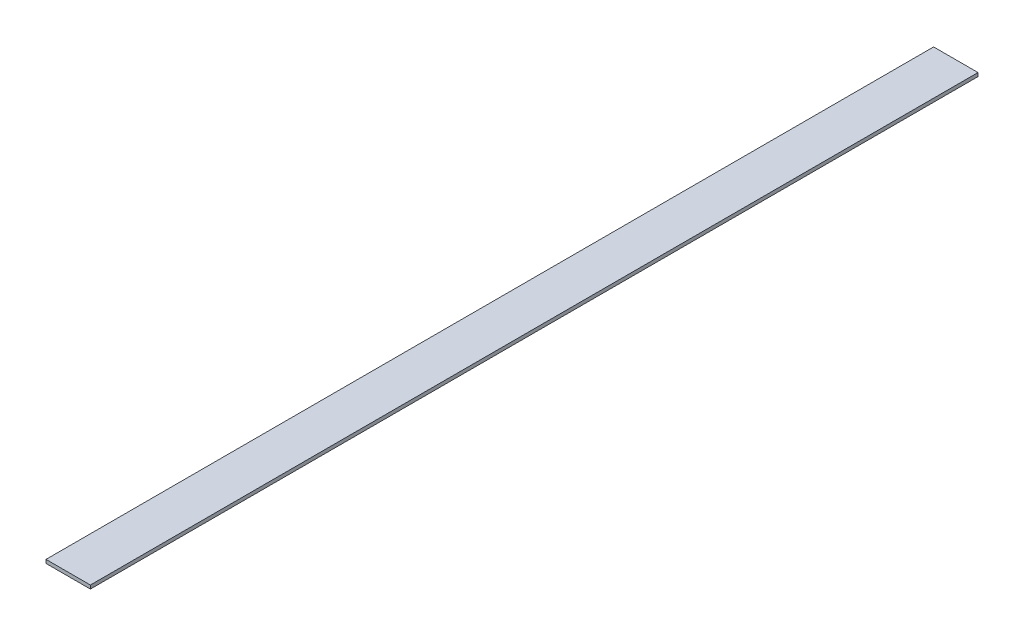
ISO-10303-21;
HEADER;
FILE_DESCRIPTION(('STEP AP214'),'2;1');
FILE_NAME('part.step','',(''),(''),'','','');
FILE_SCHEMA(('AUTOMOTIVE_DESIGN { 1 0 10303 214 1 1 1 1 }'));
ENDSEC;
DATA;
#1=APPLICATION_CONTEXT('core data for automotive mechanical design processes');
#2=APPLICATION_PROTOCOL_DEFINITION('international standard','automotive_design',2000,#1);
#3=PRODUCT_CONTEXT('',#1,'mechanical');
#4=PRODUCT('Part','Part','',(#3));
#5=PRODUCT_RELATED_PRODUCT_CATEGORY('part','',(#4));
#6=PRODUCT_DEFINITION_FORMATION('','',#4);
#7=PRODUCT_DEFINITION_CONTEXT('part definition',#1,'design');
#8=PRODUCT_DEFINITION('design','',#6,#7);
#9=PRODUCT_DEFINITION_SHAPE('','',#8);
#10=(LENGTH_UNIT() NAMED_UNIT(*) SI_UNIT(.MILLI.,.METRE.));
#11=(NAMED_UNIT(*) PLANE_ANGLE_UNIT() SI_UNIT($,.RADIAN.));
#12=(NAMED_UNIT(*) SI_UNIT($,.STERADIAN.) SOLID_ANGLE_UNIT());
#13=UNCERTAINTY_MEASURE_WITH_UNIT(LENGTH_MEASURE(1.E-05),#10,'distance_accuracy_value','');
#14=(GEOMETRIC_REPRESENTATION_CONTEXT(3) GLOBAL_UNCERTAINTY_ASSIGNED_CONTEXT((#13)) GLOBAL_UNIT_ASSIGNED_CONTEXT((#10,
#11,#12)) REPRESENTATION_CONTEXT('',''));
#15=CARTESIAN_POINT('',(0.,0.,0.));
#16=DIRECTION('',(0.,0.,1.));
#17=DIRECTION('',(1.,0.,0.));
#18=AXIS2_PLACEMENT_3D('',#15,#16,#17);
#19=CARTESIAN_POINT('',(25.0000000000005,0.,499.999999999997));
#20=DIRECTION('',(0.999999999999994,0.,0.));
#21=DIRECTION('',(0.,1.,0.));
#22=AXIS2_PLACEMENT_3D('',#19,#20,#21);
#23=PLANE('',#22);
#24=DIRECTION('',(0.,-1.,0.));
#25=VECTOR('',#24,1.);
#26=CARTESIAN_POINT('',(25.0000000000005,0.,0.));
#27=LINE('',#26,#25);
#28=CARTESIAN_POINT('',(25.0000000000006,25.,0.));
#29=VERTEX_POINT('',#28);
#30=CARTESIAN_POINT('',(25.0000000000006,23.,0.));
#31=VERTEX_POINT('',#30);
#32=EDGE_CURVE('E165',#29,#31,#27,.T.);
#33=ORIENTED_EDGE('',*,*,#32,.F.);
#34=DIRECTION('',(0.,0.,-0.999999999999994));
#35=VECTOR('',#34,1.);
#36=CARTESIAN_POINT('',(25.0000000000005,25.,499.999999999997));
#37=LINE('',#36,#35);
#38=CARTESIAN_POINT('',(25.0000000000005,25.,499.999999999997));
#39=VERTEX_POINT('',#38);
#40=EDGE_CURVE('E94',#39,#29,#37,.T.);
#41=ORIENTED_EDGE('',*,*,#40,.F.);
#42=DIRECTION('',(0.,-1.,0.));
#43=VECTOR('',#42,1.);
#44=CARTESIAN_POINT('',(25.0000000000005,0.,499.999999999997));
#45=LINE('',#44,#43);
#46=CARTESIAN_POINT('',(25.0000000000005,23.,499.999999999997));
#47=VERTEX_POINT('',#46);
#48=EDGE_CURVE('E188',#39,#47,#45,.T.);
#49=ORIENTED_EDGE('',*,*,#48,.T.);
#50=DIRECTION('',(0.,0.,-0.999999999999994));
#51=VECTOR('',#50,1.);
#52=CARTESIAN_POINT('',(25.0000000000005,23.,499.999999999997));
#53=LINE('',#52,#51);
#54=EDGE_CURVE('E181',#47,#31,#53,.T.);
#55=ORIENTED_EDGE('',*,*,#54,.T.);
#56=EDGE_LOOP('',(#33,#41,#49,#55));
#57=FACE_BOUND('',#56,.T.);
#58=ADVANCED_FACE('F44',(#57),#23,.T.);
#59=CARTESIAN_POINT('',(1.33226762955018E-12,25.,499.999999999997));
#60=DIRECTION('',(0.,1.,0.));
#61=DIRECTION('',(0.,0.,0.999999999999994));
#62=AXIS2_PLACEMENT_3D('',#59,#60,#61);
#63=PLANE('',#62);
#64=DIRECTION('',(0.999999999999994,0.,0.));
#65=VECTOR('',#64,1.);
#66=CARTESIAN_POINT('',(1.11022302462515E-12,25.,0.));
#67=LINE('',#66,#65);
#68=CARTESIAN_POINT('',(1.11022302462515E-12,25.,0.));
#69=VERTEX_POINT('',#68);
#70=EDGE_CURVE('E191',#69,#29,#67,.T.);
#71=ORIENTED_EDGE('',*,*,#70,.F.);
#72=DIRECTION('',(0.,0.,-0.999999999999994));
#73=VECTOR('',#72,1.);
#74=CARTESIAN_POINT('',(1.33226762955018E-12,25.,499.999999999997));
#75=LINE('',#74,#73);
#76=CARTESIAN_POINT('',(1.33226762955018E-12,25.,499.999999999997));
#77=VERTEX_POINT('',#76);
#78=EDGE_CURVE('E136',#77,#69,#75,.T.);
#79=ORIENTED_EDGE('',*,*,#78,.F.);
#80=DIRECTION('',(0.999999999999994,0.,0.));
#81=VECTOR('',#80,1.);
#82=CARTESIAN_POINT('',(1.33226762955018E-12,25.,499.999999999997));
#83=LINE('',#82,#81);
#84=EDGE_CURVE('E201',#77,#39,#83,.T.);
#85=ORIENTED_EDGE('',*,*,#84,.T.);
#86=ORIENTED_EDGE('',*,*,#40,.T.);
#87=EDGE_LOOP('',(#71,#79,#85,#86));
#88=FACE_BOUND('',#87,.T.);
#89=ADVANCED_FACE('F237',(#88),#63,.T.);
#90=CARTESIAN_POINT('',(2.2204460492503E-13,0.,499.999999999997));
#91=DIRECTION('',(-0.999999999999994,0.,0.));
#92=DIRECTION('',(0.,-1.,0.));
#93=AXIS2_PLACEMENT_3D('',#90,#91,#92);
#94=PLANE('',#93);
#95=DIRECTION('',(0.,0.707106781186548,-0.707106781186542));
#96=VECTOR('',#95,1.);
#97=CARTESIAN_POINT('',(0.,0.,22.9999999999996));
#98=LINE('',#97,#96);
#99=CARTESIAN_POINT('',(0.,0.,22.9999999999996));
#100=VERTEX_POINT('',#99);
#101=CARTESIAN_POINT('',(1.11022302462515E-12,23.,0.));
#102=VERTEX_POINT('',#101);
#103=EDGE_CURVE('E59',#100,#102,#98,.T.);
#104=ORIENTED_EDGE('',*,*,#103,.F.);
#105=DIRECTION('',(0.,0.,-0.999999999999994));
#106=VECTOR('',#105,1.);
#107=CARTESIAN_POINT('',(2.2204460492503E-13,0.,499.999999999997));
#108=LINE('',#107,#106);
#109=CARTESIAN_POINT('',(0.,2.77555756156289E-13,476.999999999997));
#110=VERTEX_POINT('',#109);
#111=EDGE_CURVE('E127',#110,#100,#108,.T.);
#112=ORIENTED_EDGE('',*,*,#111,.F.);
#113=DIRECTION('',(0.,-0.707106781186547,-0.707106781186542));
#114=VECTOR('',#113,1.);
#115=CARTESIAN_POINT('',(1.33226762955018E-12,23.,499.999999999997));
#116=LINE('',#115,#114);
#117=CARTESIAN_POINT('',(1.33226762955018E-12,23.,499.999999999997));
#118=VERTEX_POINT('',#117);
#119=EDGE_CURVE('E226',#118,#110,#116,.T.);
#120=ORIENTED_EDGE('',*,*,#119,.F.);
#121=DIRECTION('',(0.,1.,0.));
#122=VECTOR('',#121,1.);
#123=CARTESIAN_POINT('',(2.2204460492503E-13,0.,499.999999999997));
#124=LINE('',#123,#122);
#125=EDGE_CURVE('E198',#118,#77,#124,.T.);
#126=ORIENTED_EDGE('',*,*,#125,.T.);
#127=ORIENTED_EDGE('',*,*,#78,.T.);
#128=DIRECTION('',(0.,1.,0.));
#129=VECTOR('',#128,1.);
#130=CARTESIAN_POINT('',(0.,0.,0.));
#131=LINE('',#130,#129);
#132=EDGE_CURVE('E129',#102,#69,#131,.T.);
#133=ORIENTED_EDGE('',*,*,#132,.F.);
#134=EDGE_LOOP('',(#104,#112,#120,#126,#127,#133));
#135=FACE_BOUND('',#134,.T.);
#136=CARTESIAN_POINT('',(1.33226762955018E-12,12.5,99.9999999999995));
#137=DIRECTION('',(-0.999999999999994,0.,0.));
#138=DIRECTION('',(0.,-1.,0.));
#139=AXIS2_PLACEMENT_3D('',#136,#137,#138);
#140=CIRCLE('',#139,2.);
#141=CARTESIAN_POINT('',(1.33053290607421E-12,10.5,99.9999999999996));
#142=VERTEX_POINT('',#141);
#143=EDGE_CURVE('E154',#142,#142,#140,.T.);
#144=ORIENTED_EDGE('',*,*,#143,.F.);
#145=EDGE_LOOP('',(#144));
#146=FACE_BOUND('',#145,.T.);
#147=CARTESIAN_POINT('',(1.11022302462515E-12,12.5,199.999999999999));
#148=DIRECTION('',(-0.999999999999994,0.,0.));
#149=DIRECTION('',(0.,-1.,0.));
#150=AXIS2_PLACEMENT_3D('',#147,#148,#149);
#151=CIRCLE('',#150,2.);
#152=CARTESIAN_POINT('',(1.10848830114918E-12,10.5,199.999999999999));
#153=VERTEX_POINT('',#152);
#154=EDGE_CURVE('E215',#153,#153,#151,.T.);
#155=ORIENTED_EDGE('',*,*,#154,.F.);
#156=EDGE_LOOP('',(#155));
#157=FACE_BOUND('',#156,.T.);
#158=CARTESIAN_POINT('',(1.11022302462515E-12,12.5000000000002,299.999999999997));
#159=DIRECTION('',(-0.999999999999994,0.,0.));
#160=DIRECTION('',(0.,-1.,0.));
#161=AXIS2_PLACEMENT_3D('',#158,#159,#160);
#162=CIRCLE('',#161,2.);
#163=CARTESIAN_POINT('',(1.10848830114918E-12,10.5000000000002,299.999999999997));
#164=VERTEX_POINT('',#163);
#165=EDGE_CURVE('E211',#164,#164,#162,.T.);
#166=ORIENTED_EDGE('',*,*,#165,.F.);
#167=EDGE_LOOP('',(#166));
#168=FACE_BOUND('',#167,.T.);
#169=CARTESIAN_POINT('',(1.11022302462515E-12,12.5000000000002,399.999999999997));
#170=DIRECTION('',(-0.999999999999994,0.,0.));
#171=DIRECTION('',(0.,-1.,0.));
#172=AXIS2_PLACEMENT_3D('',#169,#170,#171);
#173=CIRCLE('',#172,2.);
#174=CARTESIAN_POINT('',(1.10848830114918E-12,10.5000000000002,399.999999999997));
#175=VERTEX_POINT('',#174);
#176=EDGE_CURVE('E207',#175,#175,#173,.T.);
#177=ORIENTED_EDGE('',*,*,#176,.F.);
#178=EDGE_LOOP('',(#177));
#179=FACE_BOUND('',#178,.T.);
#180=ADVANCED_FACE('F124',(#135,#146,#157,#168,#179),#94,.T.);
#181=CARTESIAN_POINT('',(2.2204460492503E-13,0.,499.999999999997));
#182=DIRECTION('',(0.,1.,0.));
#183=DIRECTION('',(0.,0.,0.999999999999994));
#184=AXIS2_PLACEMENT_3D('',#181,#182,#183);
#185=PLANE('',#184);
#186=ORIENTED_EDGE('',*,*,#111,.T.);
#187=DIRECTION('',(-0.999999999999994,0.,0.));
#188=VECTOR('',#187,1.);
#189=CARTESIAN_POINT('',(10.0000000000006,0.,22.9999999999996));
#190=LINE('',#189,#188);
#191=CARTESIAN_POINT('',(2.00000000000076,0.,22.9999999999996));
#192=VERTEX_POINT('',#191);
#193=EDGE_CURVE('E111',#192,#100,#190,.T.);
#194=ORIENTED_EDGE('',*,*,#193,.F.);
#195=DIRECTION('',(0.,0.,-0.999999999999994));
#196=VECTOR('',#195,1.);
#197=CARTESIAN_POINT('',(2.00000000000076,0.,499.999999999997));
#198=LINE('',#197,#196);
#199=CARTESIAN_POINT('',(2.00000000000076,0.,476.999999999997));
#200=VERTEX_POINT('',#199);
#201=EDGE_CURVE('E137',#200,#192,#198,.T.);
#202=ORIENTED_EDGE('',*,*,#201,.F.);
#203=DIRECTION('',(-0.999999999999994,0.,0.));
#204=VECTOR('',#203,1.);
#205=CARTESIAN_POINT('',(10.0000000000008,0.,476.999999999997));
#206=LINE('',#205,#204);
#207=EDGE_CURVE('E131',#200,#110,#206,.T.);
#208=ORIENTED_EDGE('',*,*,#207,.T.);
#209=EDGE_LOOP('',(#186,#194,#202,#208));
#210=FACE_BOUND('',#209,.T.);
#211=ADVANCED_FACE('F134',(#210),#185,.F.);
#212=CARTESIAN_POINT('',(2.00000000000076,0.,499.999999999997));
#213=DIRECTION('',(-0.999999999999994,0.,0.));
#214=DIRECTION('',(0.,0.,0.999999999999994));
#215=AXIS2_PLACEMENT_3D('',#212,#213,#214);
#216=PLANE('',#215);
#217=CARTESIAN_POINT('',(2.00000000000076,12.5,99.9999999999996));
#218=DIRECTION('',(-0.999999999999994,0.,0.));
#219=DIRECTION('',(0.,0.,0.999999999999994));
#220=AXIS2_PLACEMENT_3D('',#217,#218,#219);
#221=CIRCLE('',#220,2.);
#222=CARTESIAN_POINT('',(2.00000000000076,10.5,99.9999999999996));
#223=VERTEX_POINT('',#222);
#224=EDGE_CURVE('E162',#223,#223,#221,.T.);
#225=ORIENTED_EDGE('',*,*,#224,.T.);
#226=EDGE_LOOP('',(#225));
#227=FACE_BOUND('',#226,.T.);
#228=CARTESIAN_POINT('',(2.00000000000021,12.5,199.999999999999));
#229=DIRECTION('',(-0.999999999999994,0.,0.));
#230=DIRECTION('',(0.,0.,0.999999999999994));
#231=AXIS2_PLACEMENT_3D('',#228,#229,#230);
#232=CIRCLE('',#231,2.);
#233=CARTESIAN_POINT('',(2.00000000000021,10.5,199.999999999999));
#234=VERTEX_POINT('',#233);
#235=EDGE_CURVE('E158',#234,#234,#232,.T.);
#236=ORIENTED_EDGE('',*,*,#235,.T.);
#237=EDGE_LOOP('',(#236));
#238=FACE_BOUND('',#237,.T.);
#239=CARTESIAN_POINT('',(2.00000000000021,12.5000000000002,299.999999999997));
#240=DIRECTION('',(-0.999999999999994,0.,0.));
#241=DIRECTION('',(0.,0.,0.999999999999994));
#242=AXIS2_PLACEMENT_3D('',#239,#240,#241);
#243=CIRCLE('',#242,2.);
#244=CARTESIAN_POINT('',(2.00000000000021,10.5000000000002,299.999999999997));
#245=VERTEX_POINT('',#244);
#246=EDGE_CURVE('E153',#245,#245,#243,.T.);
#247=ORIENTED_EDGE('',*,*,#246,.T.);
#248=EDGE_LOOP('',(#247));
#249=FACE_BOUND('',#248,.T.);
#250=CARTESIAN_POINT('',(2.00000000000065,12.5000000000002,399.999999999997));
#251=DIRECTION('',(-0.999999999999994,0.,0.));
#252=DIRECTION('',(0.,0.,0.999999999999994));
#253=AXIS2_PLACEMENT_3D('',#250,#251,#252);
#254=CIRCLE('',#253,2.);
#255=CARTESIAN_POINT('',(2.00000000000065,10.5000000000002,399.999999999997));
#256=VERTEX_POINT('',#255);
#257=EDGE_CURVE('E149',#256,#256,#254,.T.);
#258=ORIENTED_EDGE('',*,*,#257,.T.);
#259=EDGE_LOOP('',(#258));
#260=FACE_BOUND('',#259,.T.);
#261=ORIENTED_EDGE('',*,*,#201,.T.);
#262=DIRECTION('',(0.,0.707106781186548,-0.707106781186542));
#263=VECTOR('',#262,1.);
#264=CARTESIAN_POINT('',(1.99999999999999,-238.5,261.499999999997));
#265=LINE('',#264,#263);
#266=CARTESIAN_POINT('',(2.00000000000076,23.,0.));
#267=VERTEX_POINT('',#266);
#268=EDGE_CURVE('E114',#192,#267,#265,.T.);
#269=ORIENTED_EDGE('',*,*,#268,.T.);
#270=DIRECTION('',(0.,0.,-0.999999999999994));
#271=VECTOR('',#270,1.);
#272=CARTESIAN_POINT('',(2.00000000000076,23.,499.999999999997));
#273=LINE('',#272,#271);
#274=CARTESIAN_POINT('',(2.00000000000076,23.,499.999999999997));
#275=VERTEX_POINT('',#274);
#276=EDGE_CURVE('E143',#275,#267,#273,.T.);
#277=ORIENTED_EDGE('',*,*,#276,.F.);
#278=DIRECTION('',(0.,-0.707106781186547,-0.707106781186542));
#279=VECTOR('',#278,1.);
#280=CARTESIAN_POINT('',(2.00000000000076,11.5,488.499999999997));
#281=LINE('',#280,#279);
#282=EDGE_CURVE('E177',#275,#200,#281,.T.);
#283=ORIENTED_EDGE('',*,*,#282,.T.);
#284=EDGE_LOOP('',(#261,#269,#277,#283));
#285=FACE_BOUND('',#284,.T.);
#286=ADVANCED_FACE('F174',(#227,#238,#249,#260,#285),#216,.F.);
#287=CARTESIAN_POINT('',(1.33226762955018E-12,23.,499.999999999997));
#288=DIRECTION('',(0.,1.,0.));
#289=DIRECTION('',(0.,0.,0.999999999999994));
#290=AXIS2_PLACEMENT_3D('',#287,#288,#289);
#291=PLANE('',#290);
#292=DIRECTION('',(0.999999999999994,0.,0.));
#293=VECTOR('',#292,1.);
#294=CARTESIAN_POINT('',(1.11022302462515E-12,23.,0.));
#295=LINE('',#294,#293);
#296=EDGE_CURVE('E87',#267,#31,#295,.T.);
#297=ORIENTED_EDGE('',*,*,#296,.T.);
#298=ORIENTED_EDGE('',*,*,#54,.F.);
#299=DIRECTION('',(0.999999999999994,0.,0.));
#300=VECTOR('',#299,1.);
#301=CARTESIAN_POINT('',(1.33226762955018E-12,23.,499.999999999997));
#302=LINE('',#301,#300);
#303=EDGE_CURVE('E68',#275,#47,#302,.T.);
#304=ORIENTED_EDGE('',*,*,#303,.F.);
#305=ORIENTED_EDGE('',*,*,#276,.T.);
#306=EDGE_LOOP('',(#297,#298,#304,#305));
#307=FACE_BOUND('',#306,.T.);
#308=ADVANCED_FACE('F179',(#307),#291,.F.);
#309=CARTESIAN_POINT('',(2.2204460492503E-13,0.,499.999999999997));
#310=DIRECTION('',(0.,0.,0.999999999999994));
#311=DIRECTION('',(0.999999999999994,0.,0.));
#312=AXIS2_PLACEMENT_3D('',#309,#310,#311);
#313=PLANE('',#312);
#314=DIRECTION('',(-0.999999999999994,0.,0.));
#315=VECTOR('',#314,1.);
#316=CARTESIAN_POINT('',(1.33226762955018E-12,23.,499.999999999997));
#317=LINE('',#316,#315);
#318=EDGE_CURVE('E11',#275,#118,#317,.T.);
#319=ORIENTED_EDGE('',*,*,#318,.F.);
#320=ORIENTED_EDGE('',*,*,#303,.T.);
#321=ORIENTED_EDGE('',*,*,#48,.F.);
#322=ORIENTED_EDGE('',*,*,#84,.F.);
#323=ORIENTED_EDGE('',*,*,#125,.F.);
#324=EDGE_LOOP('',(#319,#320,#321,#322,#323));
#325=FACE_BOUND('',#324,.T.);
#326=ADVANCED_FACE('F234',(#325),#313,.T.);
#327=CARTESIAN_POINT('',(0.,0.,0.));
#328=DIRECTION('',(0.,0.,0.999999999999994));
#329=DIRECTION('',(0.999999999999994,0.,0.));
#330=AXIS2_PLACEMENT_3D('',#327,#328,#329);
#331=PLANE('',#330);
#332=ORIENTED_EDGE('',*,*,#296,.F.);
#333=DIRECTION('',(-0.999999999999994,0.,0.));
#334=VECTOR('',#333,1.);
#335=CARTESIAN_POINT('',(1.11022302462515E-12,23.,0.));
#336=LINE('',#335,#334);
#337=EDGE_CURVE('E52',#267,#102,#336,.T.);
#338=ORIENTED_EDGE('',*,*,#337,.T.);
#339=ORIENTED_EDGE('',*,*,#132,.T.);
#340=ORIENTED_EDGE('',*,*,#70,.T.);
#341=ORIENTED_EDGE('',*,*,#32,.T.);
#342=EDGE_LOOP('',(#332,#338,#339,#340,#341));
#343=FACE_BOUND('',#342,.T.);
#344=ADVANCED_FACE('F169',(#343),#331,.F.);
#345=CARTESIAN_POINT('',(10.0000000000008,12.5000000000002,399.999999999997));
#346=DIRECTION('',(-0.999999999999994,0.,0.));
#347=DIRECTION('',(0.,-1.,0.));
#348=AXIS2_PLACEMENT_3D('',#345,#346,#347);
#349=CYLINDRICAL_SURFACE('',#348,2.);
#350=CARTESIAN_POINT('',(1.10848830114918E-12,10.5000000000002,399.999999999997));
#351=CARTESIAN_POINT('',(0.0208333333344372,10.5000000000002,399.999999999997));
#352=CARTESIAN_POINT('',(0.0416666666677659,10.5000000000002,399.999999999997));
#353=CARTESIAN_POINT('',(0.0833333333344234,10.5000000000002,399.999999999997));
#354=CARTESIAN_POINT('',(0.104166666667752,10.5000000000002,399.999999999997));
#355=CARTESIAN_POINT('',(0.145833333334409,10.5000000000002,399.999999999997));
#356=CARTESIAN_POINT('',(0.166666666667737,10.5000000000002,399.999999999997));
#357=CARTESIAN_POINT('',(0.208333333334394,10.5000000000002,399.999999999997));
#358=CARTESIAN_POINT('',(0.229166666667723,10.5000000000002,399.999999999997));
#359=CARTESIAN_POINT('',(0.27083333333438,10.5000000000002,399.999999999997));
#360=CARTESIAN_POINT('',(0.291666666667709,10.5000000000002,399.999999999997));
#361=CARTESIAN_POINT('',(0.333333333334366,10.5000000000002,399.999999999997));
#362=CARTESIAN_POINT('',(0.354166666667695,10.5000000000002,399.999999999997));
#363=CARTESIAN_POINT('',(0.395833333334353,10.5000000000002,399.999999999997));
#364=CARTESIAN_POINT('',(0.416666666667681,10.5000000000002,399.999999999997));
#365=CARTESIAN_POINT('',(0.458333333334338,10.5000000000002,399.999999999997));
#366=CARTESIAN_POINT('',(0.479166666667666,10.5000000000002,399.999999999997));
#367=CARTESIAN_POINT('',(0.520833333334323,10.5000000000002,399.999999999997));
#368=CARTESIAN_POINT('',(0.541666666667651,10.5000000000002,399.999999999997));
#369=CARTESIAN_POINT('',(0.583333333334308,10.5000000000002,399.999999999997));
#370=CARTESIAN_POINT('',(0.604166666667636,10.5000000000002,399.999999999997));
#371=CARTESIAN_POINT('',(0.645833333334294,10.5000000000002,399.999999999997));
#372=CARTESIAN_POINT('',(0.666666666667623,10.5000000000002,399.999999999997));
#373=CARTESIAN_POINT('',(0.70833333333428,10.5000000000002,399.999999999997));
#374=CARTESIAN_POINT('',(0.729166666667609,10.5000000000002,399.999999999997));
#375=CARTESIAN_POINT('',(0.770833333334266,10.5000000000002,399.999999999997));
#376=CARTESIAN_POINT('',(0.791666666667594,10.5000000000002,399.999999999997));
#377=CARTESIAN_POINT('',(0.833333333334251,10.5000000000002,399.999999999997));
#378=CARTESIAN_POINT('',(0.854166666667579,10.5000000000002,399.999999999997));
#379=CARTESIAN_POINT('',(0.895833333334237,10.5000000000002,399.999999999997));
#380=CARTESIAN_POINT('',(0.916666666667565,10.5000000000002,399.999999999997));
#381=CARTESIAN_POINT('',(0.958333333334223,10.5000000000002,399.999999999997));
#382=CARTESIAN_POINT('',(0.979166666667552,10.5000000000002,399.999999999997));
#383=CARTESIAN_POINT('',(1.02083333333421,10.5000000000002,399.999999999997));
#384=CARTESIAN_POINT('',(1.04166666666754,10.5000000000002,399.999999999997));
#385=CARTESIAN_POINT('',(1.08333333333419,10.5000000000002,399.999999999997));
#386=CARTESIAN_POINT('',(1.10416666666752,10.5000000000002,399.999999999997));
#387=CARTESIAN_POINT('',(1.14583333333418,10.5000000000002,399.999999999997));
#388=CARTESIAN_POINT('',(1.16666666666751,10.5000000000002,399.999999999997));
#389=CARTESIAN_POINT('',(1.20833333333417,10.5000000000002,399.999999999997));
#390=CARTESIAN_POINT('',(1.22916666666749,10.5000000000002,399.999999999997));
#391=CARTESIAN_POINT('',(1.27083333333415,10.5000000000002,399.999999999997));
#392=CARTESIAN_POINT('',(1.29166666666748,10.5000000000002,399.999999999997));
#393=CARTESIAN_POINT('',(1.33333333333414,10.5000000000002,399.999999999997));
#394=CARTESIAN_POINT('',(1.35416666666747,10.5000000000002,399.999999999997));
#395=CARTESIAN_POINT('',(1.39583333333412,10.5000000000002,399.999999999997));
#396=CARTESIAN_POINT('',(1.41666666666745,10.5000000000002,399.999999999997));
#397=CARTESIAN_POINT('',(1.45833333333411,10.5000000000002,399.999999999997));
#398=CARTESIAN_POINT('',(1.47916666666744,10.5000000000002,399.999999999997));
#399=CARTESIAN_POINT('',(1.52083333333409,10.5000000000002,399.999999999997));
#400=CARTESIAN_POINT('',(1.54166666666742,10.5000000000002,399.999999999997));
#401=CARTESIAN_POINT('',(1.58333333333408,10.5000000000002,399.999999999997));
#402=CARTESIAN_POINT('',(1.60416666666741,10.5000000000002,399.999999999997));
#403=CARTESIAN_POINT('',(1.64583333333407,10.5000000000002,399.999999999997));
#404=CARTESIAN_POINT('',(1.66666666666739,10.5000000000002,399.999999999997));
#405=CARTESIAN_POINT('',(1.70833333333405,10.5000000000002,399.999999999997));
#406=CARTESIAN_POINT('',(1.72916666666738,10.5000000000002,399.999999999997));
#407=CARTESIAN_POINT('',(1.77083333333404,10.5000000000002,399.999999999997));
#408=CARTESIAN_POINT('',(1.79166666666737,10.5000000000002,399.999999999997));
#409=CARTESIAN_POINT('',(1.83333333333402,10.5000000000002,399.999999999997));
#410=CARTESIAN_POINT('',(1.85416666666735,10.5000000000002,399.999999999997));
#411=CARTESIAN_POINT('',(1.89583333333401,10.5000000000002,399.999999999997));
#412=CARTESIAN_POINT('',(1.91666666666734,10.5000000000002,399.999999999997));
#413=CARTESIAN_POINT('',(1.95833333333399,10.5000000000002,399.999999999997));
#414=CARTESIAN_POINT('',(1.97916666666732,10.5000000000002,399.999999999997));
#415=CARTESIAN_POINT('',(2.00000000000065,10.5000000000002,399.999999999997));
#416=B_SPLINE_CURVE_WITH_KNOTS('',3,(#350,#351,#352,#353,#354,#355,#356,#357,#358,#359,#360,
#361,#362,#363,#364,#365,#366,#367,#368,#369,#370,#371,#372,#373,#374,#375,#376,#377,#378,#379,
#380,#381,#382,#383,#384,#385,#386,#387,#388,#389,#390,#391,#392,#393,#394,#395,#396,#397,#398,
#399,#400,#401,#402,#403,#404,#405,#406,#407,#408,#409,#410,#411,#412,#413,#414,#415),
.UNSPECIFIED.,.F.,.F.,(4,2,2,2,2,2,2,2,2,2,2,2,2,2,2,2,2,2,2,2,2,2,2,2,2,2,2,2,2,2,2,2,4),(0.,
0.0624999999999862,0.124999999999972,0.187499999999957,0.249999999999943,0.312499999999929,
0.374999999999915,0.437499999999902,0.499999999999886,0.56249999999987,0.624999999999857,
0.687499999999843,0.749999999999829,0.812499999999813,0.874999999999799,0.937499999999786,
0.999999999999772,1.06249999999976,1.12499999999974,1.18749999999973,1.24999999999971,
1.3124999999997,1.37499999999969,1.43749999999967,1.49999999999966,1.56249999999964,
1.62499999999963,1.68749999999961,1.7499999999996,1.81249999999959,1.87499999999957,
1.93749999999956,1.99999999999954),.UNSPECIFIED.);
#417=EDGE_CURVE('BSEAM256',#175,#256,#416,.T.);
#418=ORIENTED_EDGE('',*,*,#176,.T.);
#419=ORIENTED_EDGE('',*,*,#257,.F.);
#420=ORIENTED_EDGE('',*,*,#417,.T.);
#421=ORIENTED_EDGE('',*,*,#417,.F.);
#422=EDGE_LOOP('',(#418,#420,#419,#421));
#423=FACE_BOUND('',#422,.T.);
#424=ADVANCED_FACE('F256',(#423),#349,.F.);
#425=CARTESIAN_POINT('',(9.99999999999998,12.5000000000002,299.999999999997));
#426=DIRECTION('',(-0.999999999999994,0.,0.));
#427=DIRECTION('',(0.,-1.,0.));
#428=AXIS2_PLACEMENT_3D('',#425,#426,#427);
#429=CYLINDRICAL_SURFACE('',#428,2.);
#430=CARTESIAN_POINT('',(1.10848830114918E-12,10.5000000000002,299.999999999997));
#431=CARTESIAN_POINT('',(0.0208333333344326,10.5000000000002,299.999999999997));
#432=CARTESIAN_POINT('',(0.0416666666677567,10.5000000000002,299.999999999997));
#433=CARTESIAN_POINT('',(0.0833333333344049,10.5000000000002,299.999999999997));
#434=CARTESIAN_POINT('',(0.104166666667729,10.5000000000002,299.999999999997));
#435=CARTESIAN_POINT('',(0.145833333334377,10.5000000000002,299.999999999997));
#436=CARTESIAN_POINT('',(0.1666666666677,10.5000000000002,299.999999999997));
#437=CARTESIAN_POINT('',(0.208333333334348,10.5000000000002,299.999999999997));
#438=CARTESIAN_POINT('',(0.229166666667672,10.5000000000002,299.999999999997));
#439=CARTESIAN_POINT('',(0.27083333333432,10.5000000000002,299.999999999997));
#440=CARTESIAN_POINT('',(0.291666666667644,10.5000000000002,299.999999999997));
#441=CARTESIAN_POINT('',(0.333333333334292,10.5000000000002,299.999999999997));
#442=CARTESIAN_POINT('',(0.354166666667616,10.5000000000002,299.999999999997));
#443=CARTESIAN_POINT('',(0.395833333334265,10.5000000000002,299.999999999997));
#444=CARTESIAN_POINT('',(0.416666666667589,10.5000000000002,299.999999999997));
#445=CARTESIAN_POINT('',(0.458333333334236,10.5000000000002,299.999999999997));
#446=CARTESIAN_POINT('',(0.47916666666756,10.5000000000002,299.999999999997));
#447=CARTESIAN_POINT('',(0.520833333334207,10.5000000000002,299.999999999997));
#448=CARTESIAN_POINT('',(0.54166666666753,10.5000000000002,299.999999999997));
#449=CARTESIAN_POINT('',(0.583333333334178,10.5000000000002,299.999999999997));
#450=CARTESIAN_POINT('',(0.604166666667502,10.5000000000002,299.999999999997));
#451=CARTESIAN_POINT('',(0.64583333333415,10.5000000000002,299.999999999997));
#452=CARTESIAN_POINT('',(0.666666666667475,10.5000000000002,299.999999999997));
#453=CARTESIAN_POINT('',(0.708333333334123,10.5000000000002,299.999999999997));
#454=CARTESIAN_POINT('',(0.729166666667447,10.5000000000002,299.999999999997));
#455=CARTESIAN_POINT('',(0.770833333334094,10.5000000000002,299.999999999997));
#456=CARTESIAN_POINT('',(0.791666666667418,10.5000000000002,299.999999999997));
#457=CARTESIAN_POINT('',(0.833333333334066,10.5000000000002,299.999999999997));
#458=CARTESIAN_POINT('',(0.85416666666739,10.5000000000002,299.999999999997));
#459=CARTESIAN_POINT('',(0.895833333334038,10.5000000000002,299.999999999997));
#460=CARTESIAN_POINT('',(0.916666666667362,10.5000000000002,299.999999999997));
#461=CARTESIAN_POINT('',(0.95833333333401,10.5000000000002,299.999999999997));
#462=CARTESIAN_POINT('',(0.979166666667334,10.5000000000002,299.999999999997));
#463=CARTESIAN_POINT('',(1.02083333333398,10.5000000000002,299.999999999997));
#464=CARTESIAN_POINT('',(1.04166666666731,10.5000000000002,299.999999999997));
#465=CARTESIAN_POINT('',(1.08333333333395,10.5000000000002,299.999999999997));
#466=CARTESIAN_POINT('',(1.10416666666728,10.5000000000002,299.999999999997));
#467=CARTESIAN_POINT('',(1.14583333333393,10.5000000000002,299.999999999997));
#468=CARTESIAN_POINT('',(1.16666666666725,10.5000000000002,299.999999999997));
#469=CARTESIAN_POINT('',(1.2083333333339,10.5000000000002,299.999999999997));
#470=CARTESIAN_POINT('',(1.22916666666722,10.5000000000002,299.999999999997));
#471=CARTESIAN_POINT('',(1.27083333333387,10.5000000000002,299.999999999997));
#472=CARTESIAN_POINT('',(1.29166666666719,10.5000000000002,299.999999999997));
#473=CARTESIAN_POINT('',(1.33333333333384,10.5000000000002,299.999999999997));
#474=CARTESIAN_POINT('',(1.35416666666717,10.5000000000002,299.999999999997));
#475=CARTESIAN_POINT('',(1.39583333333381,10.5000000000002,299.999999999997));
#476=CARTESIAN_POINT('',(1.41666666666714,10.5000000000002,299.999999999997));
#477=CARTESIAN_POINT('',(1.45833333333378,10.5000000000002,299.999999999997));
#478=CARTESIAN_POINT('',(1.47916666666711,10.5000000000002,299.999999999997));
#479=CARTESIAN_POINT('',(1.52083333333376,10.5000000000002,299.999999999997));
#480=CARTESIAN_POINT('',(1.54166666666708,10.5000000000002,299.999999999997));
#481=CARTESIAN_POINT('',(1.58333333333373,10.5000000000002,299.999999999997));
#482=CARTESIAN_POINT('',(1.60416666666705,10.5000000000002,299.999999999997));
#483=CARTESIAN_POINT('',(1.6458333333337,10.5000000000002,299.999999999997));
#484=CARTESIAN_POINT('',(1.66666666666702,10.5000000000002,299.999999999997));
#485=CARTESIAN_POINT('',(1.70833333333367,10.5000000000002,299.999999999997));
#486=CARTESIAN_POINT('',(1.729166666667,10.5000000000002,299.999999999997));
#487=CARTESIAN_POINT('',(1.77083333333364,10.5000000000002,299.999999999997));
#488=CARTESIAN_POINT('',(1.79166666666697,10.5000000000002,299.999999999997));
#489=CARTESIAN_POINT('',(1.83333333333362,10.5000000000002,299.999999999997));
#490=CARTESIAN_POINT('',(1.85416666666694,10.5000000000002,299.999999999997));
#491=CARTESIAN_POINT('',(1.89583333333359,10.5000000000002,299.999999999997));
#492=CARTESIAN_POINT('',(1.91666666666691,10.5000000000002,299.999999999997));
#493=CARTESIAN_POINT('',(1.95833333333356,10.5000000000002,299.999999999997));
#494=CARTESIAN_POINT('',(1.97916666666688,10.5000000000002,299.999999999997));
#495=CARTESIAN_POINT('',(2.00000000000021,10.5000000000002,299.999999999997));
#496=B_SPLINE_CURVE_WITH_KNOTS('',3,(#430,#431,#432,#433,#434,#435,#436,#437,#438,#439,#440,
#441,#442,#443,#444,#445,#446,#447,#448,#449,#450,#451,#452,#453,#454,#455,#456,#457,#458,#459,
#460,#461,#462,#463,#464,#465,#466,#467,#468,#469,#470,#471,#472,#473,#474,#475,#476,#477,#478,
#479,#480,#481,#482,#483,#484,#485,#486,#487,#488,#489,#490,#491,#492,#493,#494,#495),
.UNSPECIFIED.,.F.,.F.,(4,2,2,2,2,2,2,2,2,2,2,2,2,2,2,2,2,2,2,2,2,2,2,2,2,2,2,2,2,2,2,2,4),(0.,
0.0624999999999723,0.124999999999945,0.187499999999915,0.249999999999887,0.31249999999986,
0.374999999999832,0.437499999999804,0.499999999999775,0.562499999999746,0.624999999999718,
0.68749999999969,0.749999999999662,0.812499999999633,0.874999999999605,0.937499999999578,
0.99999999999955,1.06249999999952,1.12499999999949,1.18749999999947,1.24999999999944,
1.31249999999941,1.37499999999938,1.43749999999935,1.49999999999932,1.5624999999993,
1.62499999999927,1.68749999999924,1.74999999999921,1.81249999999918,1.87499999999916,
1.93749999999913,1.9999999999991),.UNSPECIFIED.);
#497=EDGE_CURVE('BSEAM261',#164,#245,#496,.T.);
#498=ORIENTED_EDGE('',*,*,#165,.T.);
#499=ORIENTED_EDGE('',*,*,#246,.F.);
#500=ORIENTED_EDGE('',*,*,#497,.T.);
#501=ORIENTED_EDGE('',*,*,#497,.F.);
#502=EDGE_LOOP('',(#498,#500,#499,#501));
#503=FACE_BOUND('',#502,.T.);
#504=ADVANCED_FACE('F261',(#503),#429,.F.);
#505=CARTESIAN_POINT('',(9.99999999999998,12.5,199.999999999999));
#506=DIRECTION('',(-0.999999999999994,0.,0.));
#507=DIRECTION('',(0.,-1.,0.));
#508=AXIS2_PLACEMENT_3D('',#505,#506,#507);
#509=CYLINDRICAL_SURFACE('',#508,2.);
#510=CARTESIAN_POINT('',(1.10848830114918E-12,10.5,199.999999999999));
#511=CARTESIAN_POINT('',(0.0208333333344326,10.5,199.999999999999));
#512=CARTESIAN_POINT('',(0.0416666666677567,10.5,199.999999999999));
#513=CARTESIAN_POINT('',(0.0833333333344049,10.5,199.999999999999));
#514=CARTESIAN_POINT('',(0.104166666667729,10.5,199.999999999999));
#515=CARTESIAN_POINT('',(0.145833333334377,10.5,199.999999999999));
#516=CARTESIAN_POINT('',(0.1666666666677,10.5,199.999999999999));
#517=CARTESIAN_POINT('',(0.208333333334348,10.5,199.999999999999));
#518=CARTESIAN_POINT('',(0.229166666667672,10.5,199.999999999999));
#519=CARTESIAN_POINT('',(0.27083333333432,10.5,199.999999999999));
#520=CARTESIAN_POINT('',(0.291666666667644,10.5,199.999999999999));
#521=CARTESIAN_POINT('',(0.333333333334292,10.5,199.999999999999));
#522=CARTESIAN_POINT('',(0.354166666667616,10.5,199.999999999999));
#523=CARTESIAN_POINT('',(0.395833333334265,10.5,199.999999999999));
#524=CARTESIAN_POINT('',(0.416666666667589,10.5,199.999999999999));
#525=CARTESIAN_POINT('',(0.458333333334236,10.5,199.999999999999));
#526=CARTESIAN_POINT('',(0.47916666666756,10.5,199.999999999999));
#527=CARTESIAN_POINT('',(0.520833333334207,10.5,199.999999999999));
#528=CARTESIAN_POINT('',(0.54166666666753,10.5,199.999999999999));
#529=CARTESIAN_POINT('',(0.583333333334178,10.5,199.999999999999));
#530=CARTESIAN_POINT('',(0.604166666667502,10.5,199.999999999999));
#531=CARTESIAN_POINT('',(0.64583333333415,10.5,199.999999999999));
#532=CARTESIAN_POINT('',(0.666666666667475,10.5,199.999999999999));
#533=CARTESIAN_POINT('',(0.708333333334123,10.5,199.999999999999));
#534=CARTESIAN_POINT('',(0.729166666667447,10.5,199.999999999999));
#535=CARTESIAN_POINT('',(0.770833333334094,10.5,199.999999999999));
#536=CARTESIAN_POINT('',(0.791666666667418,10.5,199.999999999999));
#537=CARTESIAN_POINT('',(0.833333333334066,10.5,199.999999999999));
#538=CARTESIAN_POINT('',(0.85416666666739,10.5,199.999999999999));
#539=CARTESIAN_POINT('',(0.895833333334038,10.5,199.999999999999));
#540=CARTESIAN_POINT('',(0.916666666667362,10.5,199.999999999999));
#541=CARTESIAN_POINT('',(0.95833333333401,10.5,199.999999999999));
#542=CARTESIAN_POINT('',(0.979166666667334,10.5,199.999999999999));
#543=CARTESIAN_POINT('',(1.02083333333398,10.5,199.999999999999));
#544=CARTESIAN_POINT('',(1.04166666666731,10.5,199.999999999999));
#545=CARTESIAN_POINT('',(1.08333333333395,10.5,199.999999999999));
#546=CARTESIAN_POINT('',(1.10416666666728,10.5,199.999999999999));
#547=CARTESIAN_POINT('',(1.14583333333393,10.5,199.999999999999));
#548=CARTESIAN_POINT('',(1.16666666666725,10.5,199.999999999999));
#549=CARTESIAN_POINT('',(1.2083333333339,10.5,199.999999999999));
#550=CARTESIAN_POINT('',(1.22916666666722,10.5,199.999999999999));
#551=CARTESIAN_POINT('',(1.27083333333387,10.5,199.999999999999));
#552=CARTESIAN_POINT('',(1.29166666666719,10.5,199.999999999999));
#553=CARTESIAN_POINT('',(1.33333333333384,10.5,199.999999999999));
#554=CARTESIAN_POINT('',(1.35416666666717,10.5,199.999999999999));
#555=CARTESIAN_POINT('',(1.39583333333381,10.5,199.999999999999));
#556=CARTESIAN_POINT('',(1.41666666666714,10.5,199.999999999999));
#557=CARTESIAN_POINT('',(1.45833333333378,10.5,199.999999999999));
#558=CARTESIAN_POINT('',(1.47916666666711,10.5,199.999999999999));
#559=CARTESIAN_POINT('',(1.52083333333376,10.5,199.999999999999));
#560=CARTESIAN_POINT('',(1.54166666666708,10.5,199.999999999999));
#561=CARTESIAN_POINT('',(1.58333333333373,10.5,199.999999999999));
#562=CARTESIAN_POINT('',(1.60416666666705,10.5,199.999999999999));
#563=CARTESIAN_POINT('',(1.6458333333337,10.5,199.999999999999));
#564=CARTESIAN_POINT('',(1.66666666666702,10.5,199.999999999999));
#565=CARTESIAN_POINT('',(1.70833333333367,10.5,199.999999999999));
#566=CARTESIAN_POINT('',(1.729166666667,10.5,199.999999999999));
#567=CARTESIAN_POINT('',(1.77083333333364,10.5,199.999999999999));
#568=CARTESIAN_POINT('',(1.79166666666697,10.5,199.999999999999));
#569=CARTESIAN_POINT('',(1.83333333333362,10.5,199.999999999999));
#570=CARTESIAN_POINT('',(1.85416666666694,10.5,199.999999999999));
#571=CARTESIAN_POINT('',(1.89583333333359,10.5,199.999999999999));
#572=CARTESIAN_POINT('',(1.91666666666691,10.5,199.999999999999));
#573=CARTESIAN_POINT('',(1.95833333333356,10.5,199.999999999999));
#574=CARTESIAN_POINT('',(1.97916666666688,10.5,199.999999999999));
#575=CARTESIAN_POINT('',(2.00000000000021,10.5,199.999999999999));
#576=B_SPLINE_CURVE_WITH_KNOTS('',3,(#510,#511,#512,#513,#514,#515,#516,#517,#518,#519,#520,
#521,#522,#523,#524,#525,#526,#527,#528,#529,#530,#531,#532,#533,#534,#535,#536,#537,#538,#539,
#540,#541,#542,#543,#544,#545,#546,#547,#548,#549,#550,#551,#552,#553,#554,#555,#556,#557,#558,
#559,#560,#561,#562,#563,#564,#565,#566,#567,#568,#569,#570,#571,#572,#573,#574,#575),
.UNSPECIFIED.,.F.,.F.,(4,2,2,2,2,2,2,2,2,2,2,2,2,2,2,2,2,2,2,2,2,2,2,2,2,2,2,2,2,2,2,2,4),(0.,
0.0624999999999723,0.124999999999945,0.187499999999915,0.249999999999887,0.31249999999986,
0.374999999999832,0.437499999999804,0.499999999999775,0.562499999999746,0.624999999999718,
0.68749999999969,0.749999999999662,0.812499999999633,0.874999999999605,0.937499999999578,
0.99999999999955,1.06249999999952,1.12499999999949,1.18749999999947,1.24999999999944,
1.31249999999941,1.37499999999938,1.43749999999935,1.49999999999932,1.5624999999993,
1.62499999999927,1.68749999999924,1.74999999999921,1.81249999999918,1.87499999999916,
1.93749999999913,1.9999999999991),.UNSPECIFIED.);
#577=EDGE_CURVE('BSEAM265',#153,#234,#576,.T.);
#578=ORIENTED_EDGE('',*,*,#154,.T.);
#579=ORIENTED_EDGE('',*,*,#235,.F.);
#580=ORIENTED_EDGE('',*,*,#577,.T.);
#581=ORIENTED_EDGE('',*,*,#577,.F.);
#582=EDGE_LOOP('',(#578,#580,#579,#581));
#583=FACE_BOUND('',#582,.T.);
#584=ADVANCED_FACE('F265',(#583),#509,.F.);
#585=CARTESIAN_POINT('',(10.0000000000006,12.5,99.9999999999996));
#586=DIRECTION('',(-0.999999999999994,0.,0.));
#587=DIRECTION('',(0.,-1.,0.));
#588=AXIS2_PLACEMENT_3D('',#585,#586,#587);
#589=CYLINDRICAL_SURFACE('',#588,2.);
#590=CARTESIAN_POINT('',(1.33053290607421E-12,10.5,99.9999999999996));
#591=CARTESIAN_POINT('',(0.0208333333346581,10.5,99.9999999999996));
#592=CARTESIAN_POINT('',(0.0416666666679857,10.5,99.9999999999996));
#593=CARTESIAN_POINT('',(0.0833333333346408,10.5,99.9999999999996));
#594=CARTESIAN_POINT('',(0.104166666667968,10.5,99.9999999999996));
#595=CARTESIAN_POINT('',(0.145833333334623,10.5,99.9999999999996));
#596=CARTESIAN_POINT('',(0.16666666666795,10.5,99.9999999999996));
#597=CARTESIAN_POINT('',(0.208333333334604,10.5,99.9999999999996));
#598=CARTESIAN_POINT('',(0.229166666667932,10.5,99.9999999999996));
#599=CARTESIAN_POINT('',(0.270833333334587,10.5,99.9999999999996));
#600=CARTESIAN_POINT('',(0.291666666667915,10.5,99.9999999999996));
#601=CARTESIAN_POINT('',(0.33333333333457,10.5,99.9999999999996));
#602=CARTESIAN_POINT('',(0.354166666667897,10.5,99.9999999999996));
#603=CARTESIAN_POINT('',(0.395833333334553,10.5,99.9999999999996));
#604=CARTESIAN_POINT('',(0.41666666666788,10.5,99.9999999999996));
#605=CARTESIAN_POINT('',(0.458333333334535,10.5,99.9999999999996));
#606=CARTESIAN_POINT('',(0.479166666667862,10.5,99.9999999999996));
#607=CARTESIAN_POINT('',(0.520833333334516,10.5,99.9999999999996));
#608=CARTESIAN_POINT('',(0.541666666667843,10.5,99.9999999999996));
#609=CARTESIAN_POINT('',(0.583333333334497,10.5,99.9999999999996));
#610=CARTESIAN_POINT('',(0.604166666667825,10.5,99.9999999999996));
#611=CARTESIAN_POINT('',(0.64583333333448,10.5,99.9999999999996));
#612=CARTESIAN_POINT('',(0.666666666667808,10.5,99.9999999999996));
#613=CARTESIAN_POINT('',(0.708333333334463,10.5,99.9999999999996));
#614=CARTESIAN_POINT('',(0.72916666666779,10.5,99.9999999999996));
#615=CARTESIAN_POINT('',(0.770833333334445,10.5,99.9999999999996));
#616=CARTESIAN_POINT('',(0.791666666667772,10.5,99.9999999999996));
#617=CARTESIAN_POINT('',(0.833333333334426,10.5,99.9999999999996));
#618=CARTESIAN_POINT('',(0.854166666667754,10.5,99.9999999999996));
#619=CARTESIAN_POINT('',(0.895833333334409,10.5,99.9999999999996));
#620=CARTESIAN_POINT('',(0.916666666667737,10.5,99.9999999999996));
#621=CARTESIAN_POINT('',(0.958333333334392,10.5,99.9999999999996));
#622=CARTESIAN_POINT('',(0.979166666667719,10.5,99.9999999999996));
#623=CARTESIAN_POINT('',(1.02083333333437,10.5,99.9999999999996));
#624=CARTESIAN_POINT('',(1.0416666666677,10.5,99.9999999999996));
#625=CARTESIAN_POINT('',(1.08333333333436,10.5,99.9999999999996));
#626=CARTESIAN_POINT('',(1.10416666666768,10.5,99.9999999999996));
#627=CARTESIAN_POINT('',(1.14583333333434,10.5,99.9999999999996));
#628=CARTESIAN_POINT('',(1.16666666666767,10.5,99.9999999999996));
#629=CARTESIAN_POINT('',(1.20833333333432,10.5,99.9999999999996));
#630=CARTESIAN_POINT('',(1.22916666666765,10.5,99.9999999999996));
#631=CARTESIAN_POINT('',(1.2708333333343,10.5,99.9999999999996));
#632=CARTESIAN_POINT('',(1.29166666666763,10.5,99.9999999999996));
#633=CARTESIAN_POINT('',(1.33333333333429,10.5,99.9999999999996));
#634=CARTESIAN_POINT('',(1.35416666666761,10.5,99.9999999999996));
#635=CARTESIAN_POINT('',(1.39583333333427,10.5,99.9999999999996));
#636=CARTESIAN_POINT('',(1.41666666666759,10.5,99.9999999999996));
#637=CARTESIAN_POINT('',(1.45833333333425,10.5,99.9999999999996));
#638=CARTESIAN_POINT('',(1.47916666666758,10.5,99.9999999999996));
#639=CARTESIAN_POINT('',(1.52083333333423,10.5,99.9999999999996));
#640=CARTESIAN_POINT('',(1.54166666666756,10.5,99.9999999999996));
#641=CARTESIAN_POINT('',(1.58333333333421,10.5,99.9999999999996));
#642=CARTESIAN_POINT('',(1.60416666666754,10.5,99.9999999999996));
#643=CARTESIAN_POINT('',(1.6458333333342,10.5,99.9999999999996));
#644=CARTESIAN_POINT('',(1.66666666666752,10.5,99.9999999999996));
#645=CARTESIAN_POINT('',(1.70833333333418,10.5,99.9999999999996));
#646=CARTESIAN_POINT('',(1.72916666666751,10.5,99.9999999999996));
#647=CARTESIAN_POINT('',(1.77083333333416,10.5,99.9999999999996));
#648=CARTESIAN_POINT('',(1.79166666666749,10.5,99.9999999999996));
#649=CARTESIAN_POINT('',(1.83333333333414,10.5,99.9999999999996));
#650=CARTESIAN_POINT('',(1.85416666666747,10.5,99.9999999999996));
#651=CARTESIAN_POINT('',(1.89583333333413,10.5,99.9999999999996));
#652=CARTESIAN_POINT('',(1.91666666666745,10.5,99.9999999999996));
#653=CARTESIAN_POINT('',(1.95833333333411,10.5,99.9999999999996));
#654=CARTESIAN_POINT('',(1.97916666666744,10.5,99.9999999999996));
#655=CARTESIAN_POINT('',(2.00000000000076,10.5,99.9999999999996));
#656=B_SPLINE_CURVE_WITH_KNOTS('',3,(#590,#591,#592,#593,#594,#595,#596,#597,#598,#599,#600,
#601,#602,#603,#604,#605,#606,#607,#608,#609,#610,#611,#612,#613,#614,#615,#616,#617,#618,#619,
#620,#621,#622,#623,#624,#625,#626,#627,#628,#629,#630,#631,#632,#633,#634,#635,#636,#637,#638,
#639,#640,#641,#642,#643,#644,#645,#646,#647,#648,#649,#650,#651,#652,#653,#654,#655),
.UNSPECIFIED.,.F.,.F.,(4,2,2,2,2,2,2,2,2,2,2,2,2,2,2,2,2,2,2,2,2,2,2,2,2,2,2,2,2,2,2,2,4),(0.,
0.0624999999999827,0.124999999999965,0.187499999999946,0.249999999999929,0.312499999999912,
0.374999999999895,0.437499999999877,0.499999999999858,0.562499999999839,0.624999999999822,
0.687499999999805,0.749999999999787,0.812499999999768,0.874999999999751,0.937499999999734,
0.999999999999716,1.0624999999997,1.12499999999968,1.18749999999966,1.24999999999965,
1.31249999999963,1.37499999999961,1.43749999999959,1.49999999999957,1.56249999999956,
1.62499999999954,1.68749999999952,1.7499999999995,1.81249999999948,1.87499999999947,
1.93749999999945,1.99999999999943),.UNSPECIFIED.);
#657=EDGE_CURVE('BSEAM269',#142,#223,#656,.T.);
#658=ORIENTED_EDGE('',*,*,#143,.T.);
#659=ORIENTED_EDGE('',*,*,#224,.F.);
#660=ORIENTED_EDGE('',*,*,#657,.T.);
#661=ORIENTED_EDGE('',*,*,#657,.F.);
#662=EDGE_LOOP('',(#658,#660,#659,#661));
#663=FACE_BOUND('',#662,.T.);
#664=ADVANCED_FACE('F269',(#663),#589,.F.);
#665=CARTESIAN_POINT('',(10.0000000000006,0.,22.9999999999996));
#666=DIRECTION('',(0.,0.707106781186548,0.707106781186542));
#667=DIRECTION('',(0.,-0.707106781186548,0.707106781186542));
#668=AXIS2_PLACEMENT_3D('',#665,#666,#667);
#669=PLANE('',#668);
#670=ORIENTED_EDGE('',*,*,#193,.T.);
#671=ORIENTED_EDGE('',*,*,#103,.T.);
#672=ORIENTED_EDGE('',*,*,#337,.F.);
#673=ORIENTED_EDGE('',*,*,#268,.F.);
#674=EDGE_LOOP('',(#670,#671,#672,#673));
#675=FACE_BOUND('',#674,.T.);
#676=ADVANCED_FACE('F112',(#675),#669,.F.);
#677=CARTESIAN_POINT('',(10.0000000000006,23.,499.999999999997));
#678=DIRECTION('',(0.,0.707106781186548,-0.707106781186542));
#679=DIRECTION('',(0.,0.707106781186547,0.707106781186542));
#680=AXIS2_PLACEMENT_3D('',#677,#678,#679);
#681=PLANE('',#680);
#682=ORIENTED_EDGE('',*,*,#318,.T.);
#683=ORIENTED_EDGE('',*,*,#119,.T.);
#684=ORIENTED_EDGE('',*,*,#207,.F.);
#685=ORIENTED_EDGE('',*,*,#282,.F.);
#686=EDGE_LOOP('',(#682,#683,#684,#685));
#687=FACE_BOUND('',#686,.T.);
#688=ADVANCED_FACE('F230',(#687),#681,.F.);
#689=CLOSED_SHELL('',(#58,#89,#180,#211,#286,#308,#326,#344,#424,#504,#584,#664,#676,#688));
#690=MANIFOLD_SOLID_BREP('B2',#689);
#691=ADVANCED_BREP_SHAPE_REPRESENTATION('',(#18,#690),#14);
#692=SHAPE_DEFINITION_REPRESENTATION(#9,#691);
ENDSEC;
END-ISO-10303-21;
